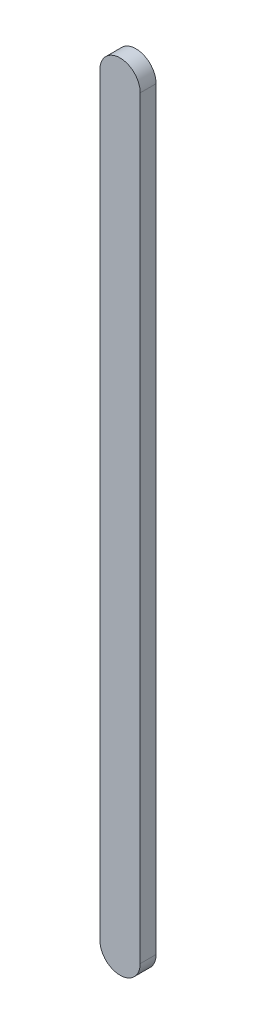
ISO-10303-21;
HEADER;
FILE_DESCRIPTION(('STEP AP214'),'2;1');
FILE_NAME('part.step','',(''),(''),'','','');
FILE_SCHEMA(('AUTOMOTIVE_DESIGN { 1 0 10303 214 1 1 1 1 }'));
ENDSEC;
DATA;
#1=APPLICATION_CONTEXT('core data for automotive mechanical design processes');
#2=APPLICATION_PROTOCOL_DEFINITION('international standard','automotive_design',2000,#1);
#3=PRODUCT_CONTEXT('',#1,'mechanical');
#4=PRODUCT('Part','Part','',(#3));
#5=PRODUCT_RELATED_PRODUCT_CATEGORY('part','',(#4));
#6=PRODUCT_DEFINITION_FORMATION('','',#4);
#7=PRODUCT_DEFINITION_CONTEXT('part definition',#1,'design');
#8=PRODUCT_DEFINITION('design','',#6,#7);
#9=PRODUCT_DEFINITION_SHAPE('','',#8);
#10=(LENGTH_UNIT() NAMED_UNIT(*) SI_UNIT(.MILLI.,.METRE.));
#11=(NAMED_UNIT(*) PLANE_ANGLE_UNIT() SI_UNIT($,.RADIAN.));
#12=(NAMED_UNIT(*) SI_UNIT($,.STERADIAN.) SOLID_ANGLE_UNIT());
#13=UNCERTAINTY_MEASURE_WITH_UNIT(LENGTH_MEASURE(1.E-05),#10,'distance_accuracy_value','');
#14=(GEOMETRIC_REPRESENTATION_CONTEXT(3) GLOBAL_UNCERTAINTY_ASSIGNED_CONTEXT((#13)) GLOBAL_UNIT_ASSIGNED_CONTEXT((#10,
#11,#12)) REPRESENTATION_CONTEXT('',''));
#15=CARTESIAN_POINT('',(0.,0.,0.));
#16=DIRECTION('',(0.,0.,1.));
#17=DIRECTION('',(1.,0.,0.));
#18=AXIS2_PLACEMENT_3D('',#15,#16,#17);
#19=CARTESIAN_POINT('',(116.5606,69.8246,0.));
#20=DIRECTION('',(-1.,0.,0.));
#21=DIRECTION('',(0.,1.,0.));
#22=AXIS2_PLACEMENT_3D('',#19,#20,#21);
#23=PLANE('',#22);
#24=DIRECTION('',(0.,1.,0.));
#25=VECTOR('',#24,1.);
#26=CARTESIAN_POINT('',(116.5606,69.8246,0.1999996));
#27=LINE('',#26,#25);
#28=CARTESIAN_POINT('',(116.5606,69.8246,0.1999996));
#29=VERTEX_POINT('',#28);
#30=CARTESIAN_POINT('',(116.5606,79.3242,0.1999996));
#31=VERTEX_POINT('',#30);
#32=EDGE_CURVE('E11',#29,#31,#27,.T.);
#33=ORIENTED_EDGE('',*,*,#32,.F.);
#34=DIRECTION('',(0.,0.,1.));
#35=VECTOR('',#34,1.);
#36=CARTESIAN_POINT('',(116.5606,69.8246,0.));
#37=LINE('',#36,#35);
#38=CARTESIAN_POINT('',(116.5606,69.8246,0.));
#39=VERTEX_POINT('',#38);
#40=EDGE_CURVE('E24',#39,#29,#37,.T.);
#41=ORIENTED_EDGE('',*,*,#40,.F.);
#42=DIRECTION('',(0.,1.,0.));
#43=VECTOR('',#42,1.);
#44=CARTESIAN_POINT('',(116.5606,69.8246,0.));
#45=LINE('',#44,#43);
#46=CARTESIAN_POINT('',(116.5606,79.3242,0.));
#47=VERTEX_POINT('',#46);
#48=EDGE_CURVE('E75',#39,#47,#45,.T.);
#49=ORIENTED_EDGE('',*,*,#48,.T.);
#50=DIRECTION('',(0.,0.,1.));
#51=VECTOR('',#50,1.);
#52=CARTESIAN_POINT('',(116.5606,79.3242,0.));
#53=LINE('',#52,#51);
#54=EDGE_CURVE('E37',#47,#31,#53,.T.);
#55=ORIENTED_EDGE('',*,*,#54,.T.);
#56=EDGE_LOOP('',(#33,#41,#49,#55));
#57=FACE_BOUND('',#56,.T.);
#58=ADVANCED_FACE('F17',(#57),#23,.F.);
#59=CARTESIAN_POINT('',(116.3066,79.3242,0.));
#60=DIRECTION('',(0.,0.,-1.));
#61=DIRECTION('',(1.,0.,0.));
#62=AXIS2_PLACEMENT_3D('',#59,#60,#61);
#63=CYLINDRICAL_SURFACE('',#62,0.254);
#64=CARTESIAN_POINT('',(116.3066,79.3242,0.1999996));
#65=DIRECTION('',(0.,0.,1.));
#66=DIRECTION('',(1.,0.,0.));
#67=AXIS2_PLACEMENT_3D('',#64,#65,#66);
#68=CIRCLE('',#67,0.254);
#69=CARTESIAN_POINT('',(116.0526,79.3242,0.1999996));
#70=VERTEX_POINT('',#69);
#71=EDGE_CURVE('E83',#31,#70,#68,.T.);
#72=ORIENTED_EDGE('',*,*,#71,.F.);
#73=ORIENTED_EDGE('',*,*,#54,.F.);
#74=CARTESIAN_POINT('',(116.3066,79.3242,0.));
#75=DIRECTION('',(0.,0.,1.));
#76=DIRECTION('',(1.,0.,0.));
#77=AXIS2_PLACEMENT_3D('',#74,#75,#76);
#78=CIRCLE('',#77,0.254);
#79=CARTESIAN_POINT('',(116.0526,79.3242,0.));
#80=VERTEX_POINT('',#79);
#81=EDGE_CURVE('E81',#47,#80,#78,.T.);
#82=ORIENTED_EDGE('',*,*,#81,.T.);
#83=DIRECTION('',(0.,0.,1.));
#84=VECTOR('',#83,1.);
#85=CARTESIAN_POINT('',(116.0526,79.3242,0.));
#86=LINE('',#85,#84);
#87=EDGE_CURVE('E67',#80,#70,#86,.T.);
#88=ORIENTED_EDGE('',*,*,#87,.T.);
#89=EDGE_LOOP('',(#72,#73,#82,#88));
#90=FACE_BOUND('',#89,.T.);
#91=ADVANCED_FACE('F89',(#90),#63,.T.);
#92=CARTESIAN_POINT('',(116.0526,79.3242,0.));
#93=DIRECTION('',(1.,0.,0.));
#94=DIRECTION('',(0.,-1.,0.));
#95=AXIS2_PLACEMENT_3D('',#92,#93,#94);
#96=PLANE('',#95);
#97=DIRECTION('',(0.,-1.,0.));
#98=VECTOR('',#97,1.);
#99=CARTESIAN_POINT('',(116.0526,79.3242,0.1999996));
#100=LINE('',#99,#98);
#101=CARTESIAN_POINT('',(116.0526,69.8246,0.1999996));
#102=VERTEX_POINT('',#101);
#103=EDGE_CURVE('E71',#70,#102,#100,.T.);
#104=ORIENTED_EDGE('',*,*,#103,.F.);
#105=ORIENTED_EDGE('',*,*,#87,.F.);
#106=DIRECTION('',(0.,-1.,0.));
#107=VECTOR('',#106,1.);
#108=CARTESIAN_POINT('',(116.0526,79.3242,0.));
#109=LINE('',#108,#107);
#110=CARTESIAN_POINT('',(116.0526,69.8246,0.));
#111=VERTEX_POINT('',#110);
#112=EDGE_CURVE('E63',#80,#111,#109,.T.);
#113=ORIENTED_EDGE('',*,*,#112,.T.);
#114=DIRECTION('',(0.,0.,1.));
#115=VECTOR('',#114,1.);
#116=CARTESIAN_POINT('',(116.0526,69.8246,0.));
#117=LINE('',#116,#115);
#118=EDGE_CURVE('E53',#111,#102,#117,.T.);
#119=ORIENTED_EDGE('',*,*,#118,.T.);
#120=EDGE_LOOP('',(#104,#105,#113,#119));
#121=FACE_BOUND('',#120,.T.);
#122=ADVANCED_FACE('F66',(#121),#96,.F.);
#123=CARTESIAN_POINT('',(116.3066,69.8246,0.));
#124=DIRECTION('',(0.,0.,-1.));
#125=DIRECTION('',(-1.,0.,0.));
#126=AXIS2_PLACEMENT_3D('',#123,#124,#125);
#127=CYLINDRICAL_SURFACE('',#126,0.253999999999995);
#128=CARTESIAN_POINT('',(116.3066,69.8246,0.1999996));
#129=DIRECTION('',(0.,0.,1.));
#130=DIRECTION('',(-1.,0.,0.));
#131=AXIS2_PLACEMENT_3D('',#128,#129,#130);
#132=CIRCLE('',#131,0.253999999999995);
#133=EDGE_CURVE('E59',#102,#29,#132,.T.);
#134=ORIENTED_EDGE('',*,*,#133,.F.);
#135=ORIENTED_EDGE('',*,*,#118,.F.);
#136=CARTESIAN_POINT('',(116.3066,69.8246,0.));
#137=DIRECTION('',(0.,0.,1.));
#138=DIRECTION('',(-1.,0.,0.));
#139=AXIS2_PLACEMENT_3D('',#136,#137,#138);
#140=CIRCLE('',#139,0.253999999999995);
#141=EDGE_CURVE('E57',#111,#39,#140,.T.);
#142=ORIENTED_EDGE('',*,*,#141,.T.);
#143=ORIENTED_EDGE('',*,*,#40,.T.);
#144=EDGE_LOOP('',(#134,#135,#142,#143));
#145=FACE_BOUND('',#144,.T.);
#146=ADVANCED_FACE('F55',(#145),#127,.T.);
#147=CARTESIAN_POINT('',(116.5606,69.8246,0.));
#148=DIRECTION('',(0.,0.,-1.));
#149=DIRECTION('',(-1.,0.,0.));
#150=AXIS2_PLACEMENT_3D('',#147,#148,#149);
#151=PLANE('',#150);
#152=ORIENTED_EDGE('',*,*,#141,.F.);
#153=ORIENTED_EDGE('',*,*,#112,.F.);
#154=ORIENTED_EDGE('',*,*,#81,.F.);
#155=ORIENTED_EDGE('',*,*,#48,.F.);
#156=EDGE_LOOP('',(#152,#153,#154,#155));
#157=FACE_BOUND('',#156,.T.);
#158=ADVANCED_FACE('F74',(#157),#151,.T.);
#159=CARTESIAN_POINT('',(116.5606,69.8246,0.1999996));
#160=DIRECTION('',(0.,0.,-1.));
#161=DIRECTION('',(-1.,0.,0.));
#162=AXIS2_PLACEMENT_3D('',#159,#160,#161);
#163=PLANE('',#162);
#164=ORIENTED_EDGE('',*,*,#32,.T.);
#165=ORIENTED_EDGE('',*,*,#71,.T.);
#166=ORIENTED_EDGE('',*,*,#103,.T.);
#167=ORIENTED_EDGE('',*,*,#133,.T.);
#168=EDGE_LOOP('',(#164,#165,#166,#167));
#169=FACE_BOUND('',#168,.T.);
#170=ADVANCED_FACE('F91',(#169),#163,.F.);
#171=CLOSED_SHELL('',(#58,#91,#122,#146,#158,#170));
#172=MANIFOLD_SOLID_BREP('B1',#171);
#173=ADVANCED_BREP_SHAPE_REPRESENTATION('',(#18,#172),#14);
#174=SHAPE_DEFINITION_REPRESENTATION(#9,#173);
ENDSEC;
END-ISO-10303-21;
